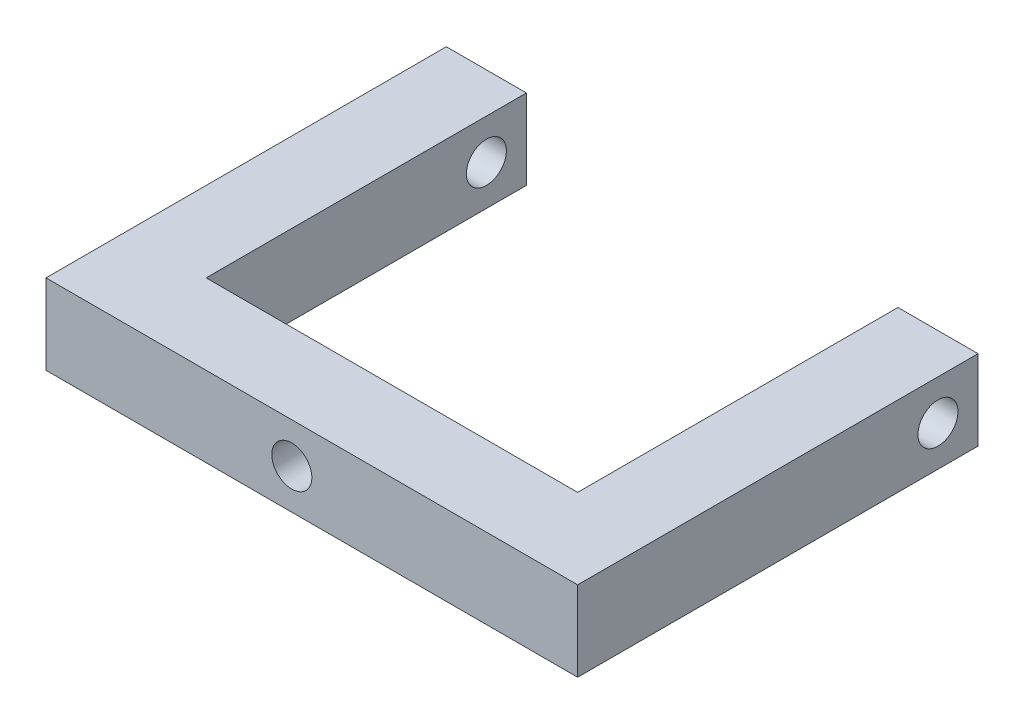
ISO-10303-21;
HEADER;
FILE_DESCRIPTION(('STEP AP214'),'2;1');
FILE_NAME('part.step','',(''),(''),'','','');
FILE_SCHEMA(('AUTOMOTIVE_DESIGN { 1 0 10303 214 1 1 1 1 }'));
ENDSEC;
DATA;
#1=APPLICATION_CONTEXT('core data for automotive mechanical design processes');
#2=APPLICATION_PROTOCOL_DEFINITION('international standard','automotive_design',2000,#1);
#3=PRODUCT_CONTEXT('',#1,'mechanical');
#4=PRODUCT('Part','Part','',(#3));
#5=PRODUCT_RELATED_PRODUCT_CATEGORY('part','',(#4));
#6=PRODUCT_DEFINITION_FORMATION('','',#4);
#7=PRODUCT_DEFINITION_CONTEXT('part definition',#1,'design');
#8=PRODUCT_DEFINITION('design','',#6,#7);
#9=PRODUCT_DEFINITION_SHAPE('','',#8);
#10=(LENGTH_UNIT() NAMED_UNIT(*) SI_UNIT(.MILLI.,.METRE.));
#11=(NAMED_UNIT(*) PLANE_ANGLE_UNIT() SI_UNIT($,.RADIAN.));
#12=(NAMED_UNIT(*) SI_UNIT($,.STERADIAN.) SOLID_ANGLE_UNIT());
#13=UNCERTAINTY_MEASURE_WITH_UNIT(LENGTH_MEASURE(1.E-05),#10,'distance_accuracy_value','');
#14=(GEOMETRIC_REPRESENTATION_CONTEXT(3) GLOBAL_UNCERTAINTY_ASSIGNED_CONTEXT((#13)) GLOBAL_UNIT_ASSIGNED_CONTEXT((#10,
#11,#12)) REPRESENTATION_CONTEXT('',''));
#15=CARTESIAN_POINT('',(0.,0.,0.));
#16=DIRECTION('',(0.,0.,1.));
#17=DIRECTION('',(1.,0.,0.));
#18=AXIS2_PLACEMENT_3D('',#15,#16,#17);
#19=CARTESIAN_POINT('',(0.,12.7,0.));
#20=DIRECTION('',(0.,0.,1.));
#21=DIRECTION('',(1.,0.,0.));
#22=AXIS2_PLACEMENT_3D('',#19,#20,#21);
#23=PLANE('',#22);
#24=CARTESIAN_POINT('',(-45.339,6.35,0.));
#25=DIRECTION('',(0.,0.,1.));
#26=DIRECTION('',(1.,0.,0.));
#27=AXIS2_PLACEMENT_3D('',#24,#25,#26);
#28=CIRCLE('',#27,3.175);
#29=CARTESIAN_POINT('',(-48.514,6.35,0.));
#30=VERTEX_POINT('',#29);
#31=EDGE_CURVE('E235',#30,#30,#28,.F.);
#32=ORIENTED_EDGE('',*,*,#31,.T.);
#33=EDGE_LOOP('',(#32));
#34=FACE_BOUND('',#33,.T.);
#35=DIRECTION('',(-1.,0.,0.));
#36=VECTOR('',#35,1.);
#37=CARTESIAN_POINT('',(0.,0.,0.));
#38=LINE('',#37,#36);
#39=CARTESIAN_POINT('',(0.,0.,0.));
#40=VERTEX_POINT('',#39);
#41=CARTESIAN_POINT('',(-84.328,0.,0.));
#42=VERTEX_POINT('',#41);
#43=EDGE_CURVE('E141',#40,#42,#38,.T.);
#44=ORIENTED_EDGE('',*,*,#43,.F.);
#45=DIRECTION('',(0.,-1.,0.));
#46=VECTOR('',#45,1.);
#47=CARTESIAN_POINT('',(0.,12.7,0.));
#48=LINE('',#47,#46);
#49=CARTESIAN_POINT('',(0.,12.7,0.));
#50=VERTEX_POINT('',#49);
#51=EDGE_CURVE('E11',#50,#40,#48,.T.);
#52=ORIENTED_EDGE('',*,*,#51,.F.);
#53=DIRECTION('',(-1.,0.,0.));
#54=VECTOR('',#53,1.);
#55=CARTESIAN_POINT('',(0.,12.7,0.));
#56=LINE('',#55,#54);
#57=CARTESIAN_POINT('',(-84.328,12.7,0.));
#58=VERTEX_POINT('',#57);
#59=EDGE_CURVE('E167',#50,#58,#56,.T.);
#60=ORIENTED_EDGE('',*,*,#59,.T.);
#61=DIRECTION('',(0.,-1.,0.));
#62=VECTOR('',#61,1.);
#63=CARTESIAN_POINT('',(-84.328,12.7,0.));
#64=LINE('',#63,#62);
#65=EDGE_CURVE('E41',#58,#42,#64,.T.);
#66=ORIENTED_EDGE('',*,*,#65,.T.);
#67=EDGE_LOOP('',(#44,#52,#60,#66));
#68=FACE_BOUND('',#67,.T.);
#69=ADVANCED_FACE('F38',(#34,#68),#23,.T.);
#70=CARTESIAN_POINT('',(0.,12.7,0.));
#71=DIRECTION('',(-1.,0.,0.));
#72=DIRECTION('',(0.,0.,1.));
#73=AXIS2_PLACEMENT_3D('',#70,#71,#72);
#74=PLANE('',#73);
#75=CARTESIAN_POINT('',(0.,6.35,-57.15));
#76=DIRECTION('',(1.,0.,0.));
#77=DIRECTION('',(0.,0.,-1.));
#78=AXIS2_PLACEMENT_3D('',#75,#76,#77);
#79=CIRCLE('',#78,3.17500000000015);
#80=CARTESIAN_POINT('',(0.,6.35,-60.3250000000002));
#81=VERTEX_POINT('',#80);
#82=EDGE_CURVE('E238',#81,#81,#79,.T.);
#83=ORIENTED_EDGE('',*,*,#82,.F.);
#84=EDGE_LOOP('',(#83));
#85=FACE_BOUND('',#84,.T.);
#86=DIRECTION('',(0.,0.,-1.));
#87=VECTOR('',#86,1.);
#88=CARTESIAN_POINT('',(0.,0.,0.));
#89=LINE('',#88,#87);
#90=CARTESIAN_POINT('',(0.,0.,-63.5));
#91=VERTEX_POINT('',#90);
#92=EDGE_CURVE('E165',#40,#91,#89,.T.);
#93=ORIENTED_EDGE('',*,*,#92,.T.);
#94=DIRECTION('',(0.,-1.,0.));
#95=VECTOR('',#94,1.);
#96=CARTESIAN_POINT('',(0.,12.7,-63.5));
#97=LINE('',#96,#95);
#98=CARTESIAN_POINT('',(0.,12.7,-63.5));
#99=VERTEX_POINT('',#98);
#100=EDGE_CURVE('E48',#99,#91,#97,.T.);
#101=ORIENTED_EDGE('',*,*,#100,.F.);
#102=DIRECTION('',(0.,0.,-1.));
#103=VECTOR('',#102,1.);
#104=CARTESIAN_POINT('',(0.,12.7,0.));
#105=LINE('',#104,#103);
#106=EDGE_CURVE('E126',#50,#99,#105,.T.);
#107=ORIENTED_EDGE('',*,*,#106,.F.);
#108=ORIENTED_EDGE('',*,*,#51,.T.);
#109=EDGE_LOOP('',(#93,#101,#107,#108));
#110=FACE_BOUND('',#109,.T.);
#111=ADVANCED_FACE('F188',(#85,#110),#74,.F.);
#112=CARTESIAN_POINT('',(-12.7,12.7,-63.5));
#113=DIRECTION('',(0.,0.,-1.));
#114=DIRECTION('',(-1.,0.,0.));
#115=AXIS2_PLACEMENT_3D('',#112,#113,#114);
#116=PLANE('',#115);
#117=DIRECTION('',(1.,0.,0.));
#118=VECTOR('',#117,1.);
#119=CARTESIAN_POINT('',(-12.7,0.,-63.5));
#120=LINE('',#119,#118);
#121=CARTESIAN_POINT('',(-12.7,0.,-63.5));
#122=VERTEX_POINT('',#121);
#123=EDGE_CURVE('E113',#122,#91,#120,.T.);
#124=ORIENTED_EDGE('',*,*,#123,.F.);
#125=DIRECTION('',(0.,-1.,0.));
#126=VECTOR('',#125,1.);
#127=CARTESIAN_POINT('',(-12.7,12.7,-63.5));
#128=LINE('',#127,#126);
#129=CARTESIAN_POINT('',(-12.7,12.7,-63.5));
#130=VERTEX_POINT('',#129);
#131=EDGE_CURVE('E108',#130,#122,#128,.T.);
#132=ORIENTED_EDGE('',*,*,#131,.F.);
#133=DIRECTION('',(1.,0.,0.));
#134=VECTOR('',#133,1.);
#135=CARTESIAN_POINT('',(-12.7,12.7,-63.5));
#136=LINE('',#135,#134);
#137=EDGE_CURVE('E111',#130,#99,#136,.T.);
#138=ORIENTED_EDGE('',*,*,#137,.T.);
#139=ORIENTED_EDGE('',*,*,#100,.T.);
#140=EDGE_LOOP('',(#124,#132,#138,#139));
#141=FACE_BOUND('',#140,.T.);
#142=ADVANCED_FACE('F110',(#141),#116,.T.);
#143=CARTESIAN_POINT('',(-12.7,12.7,-12.7));
#144=DIRECTION('',(-1.,0.,0.));
#145=DIRECTION('',(0.,0.,1.));
#146=AXIS2_PLACEMENT_3D('',#143,#144,#145);
#147=PLANE('',#146);
#148=CARTESIAN_POINT('',(-12.7,6.35,-57.15));
#149=DIRECTION('',(-1.,0.,0.));
#150=DIRECTION('',(0.,0.,1.));
#151=AXIS2_PLACEMENT_3D('',#148,#149,#150);
#152=CIRCLE('',#151,3.17500000000015);
#153=CARTESIAN_POINT('',(-12.7,6.35,-53.9749999999999));
#154=VERTEX_POINT('',#153);
#155=EDGE_CURVE('E146',#154,#154,#152,.T.);
#156=ORIENTED_EDGE('',*,*,#155,.F.);
#157=EDGE_LOOP('',(#156));
#158=FACE_BOUND('',#157,.T.);
#159=DIRECTION('',(0.,0.,-1.));
#160=VECTOR('',#159,1.);
#161=CARTESIAN_POINT('',(-12.7,0.,-12.7));
#162=LINE('',#161,#160);
#163=CARTESIAN_POINT('',(-12.7,0.,-12.7));
#164=VERTEX_POINT('',#163);
#165=EDGE_CURVE('E160',#164,#122,#162,.T.);
#166=ORIENTED_EDGE('',*,*,#165,.F.);
#167=DIRECTION('',(0.,-1.,0.));
#168=VECTOR('',#167,1.);
#169=CARTESIAN_POINT('',(-12.7,12.7,-12.7));
#170=LINE('',#169,#168);
#171=CARTESIAN_POINT('',(-12.7,12.7,-12.7));
#172=VERTEX_POINT('',#171);
#173=EDGE_CURVE('E119',#172,#164,#170,.T.);
#174=ORIENTED_EDGE('',*,*,#173,.F.);
#175=DIRECTION('',(0.,0.,-1.));
#176=VECTOR('',#175,1.);
#177=CARTESIAN_POINT('',(-12.7,12.7,-12.7));
#178=LINE('',#177,#176);
#179=EDGE_CURVE('E125',#172,#130,#178,.T.);
#180=ORIENTED_EDGE('',*,*,#179,.T.);
#181=ORIENTED_EDGE('',*,*,#131,.T.);
#182=EDGE_LOOP('',(#166,#174,#180,#181));
#183=FACE_BOUND('',#182,.T.);
#184=ADVANCED_FACE('F129',(#158,#183),#147,.T.);
#185=CARTESIAN_POINT('',(-12.7,12.7,-12.7));
#186=DIRECTION('',(0.,0.,1.));
#187=DIRECTION('',(1.,0.,0.));
#188=AXIS2_PLACEMENT_3D('',#185,#186,#187);
#189=PLANE('',#188);
#190=CARTESIAN_POINT('',(-45.339,6.35,-12.7));
#191=DIRECTION('',(0.,0.,-1.));
#192=DIRECTION('',(-1.,0.,0.));
#193=AXIS2_PLACEMENT_3D('',#190,#191,#192);
#194=CIRCLE('',#193,3.175);
#195=CARTESIAN_POINT('',(-48.514,6.35,-12.7));
#196=VERTEX_POINT('',#195);
#197=EDGE_CURVE('E239',#196,#196,#194,.T.);
#198=ORIENTED_EDGE('',*,*,#197,.F.);
#199=EDGE_LOOP('',(#198));
#200=FACE_BOUND('',#199,.T.);
#201=DIRECTION('',(-1.,0.,0.));
#202=VECTOR('',#201,1.);
#203=CARTESIAN_POINT('',(-12.7,0.,-12.7));
#204=LINE('',#203,#202);
#205=CARTESIAN_POINT('',(-71.628,0.,-12.7));
#206=VERTEX_POINT('',#205);
#207=EDGE_CURVE('E157',#164,#206,#204,.T.);
#208=ORIENTED_EDGE('',*,*,#207,.T.);
#209=DIRECTION('',(0.,-1.,0.));
#210=VECTOR('',#209,1.);
#211=CARTESIAN_POINT('',(-71.628,12.7,-12.7));
#212=LINE('',#211,#210);
#213=CARTESIAN_POINT('',(-71.628,12.7,-12.7));
#214=VERTEX_POINT('',#213);
#215=EDGE_CURVE('E173',#214,#206,#212,.T.);
#216=ORIENTED_EDGE('',*,*,#215,.F.);
#217=DIRECTION('',(-1.,0.,0.));
#218=VECTOR('',#217,1.);
#219=CARTESIAN_POINT('',(-12.7,12.7,-12.7));
#220=LINE('',#219,#218);
#221=EDGE_CURVE('E132',#172,#214,#220,.T.);
#222=ORIENTED_EDGE('',*,*,#221,.F.);
#223=ORIENTED_EDGE('',*,*,#173,.T.);
#224=EDGE_LOOP('',(#208,#216,#222,#223));
#225=FACE_BOUND('',#224,.T.);
#226=ADVANCED_FACE('F211',(#200,#225),#189,.F.);
#227=CARTESIAN_POINT('',(-71.628,12.7,-12.7));
#228=DIRECTION('',(-1.,0.,0.));
#229=DIRECTION('',(0.,0.,1.));
#230=AXIS2_PLACEMENT_3D('',#227,#228,#229);
#231=PLANE('',#230);
#232=CARTESIAN_POINT('',(-71.628,6.35,-57.15));
#233=DIRECTION('',(-1.,0.,0.));
#234=DIRECTION('',(0.,0.,1.));
#235=AXIS2_PLACEMENT_3D('',#232,#233,#234);
#236=CIRCLE('',#235,3.17500000000015);
#237=CARTESIAN_POINT('',(-71.628,6.35,-53.9749999999999));
#238=VERTEX_POINT('',#237);
#239=EDGE_CURVE('E251',#238,#238,#236,.T.);
#240=ORIENTED_EDGE('',*,*,#239,.T.);
#241=EDGE_LOOP('',(#240));
#242=FACE_BOUND('',#241,.T.);
#243=DIRECTION('',(0.,0.,-1.));
#244=VECTOR('',#243,1.);
#245=CARTESIAN_POINT('',(-71.628,0.,-12.7));
#246=LINE('',#245,#244);
#247=CARTESIAN_POINT('',(-71.628,0.,-63.5));
#248=VERTEX_POINT('',#247);
#249=EDGE_CURVE('E154',#206,#248,#246,.T.);
#250=ORIENTED_EDGE('',*,*,#249,.T.);
#251=DIRECTION('',(0.,-1.,0.));
#252=VECTOR('',#251,1.);
#253=CARTESIAN_POINT('',(-71.628,12.7,-63.5));
#254=LINE('',#253,#252);
#255=CARTESIAN_POINT('',(-71.628,12.7,-63.5));
#256=VERTEX_POINT('',#255);
#257=EDGE_CURVE('E177',#256,#248,#254,.T.);
#258=ORIENTED_EDGE('',*,*,#257,.F.);
#259=DIRECTION('',(0.,0.,-1.));
#260=VECTOR('',#259,1.);
#261=CARTESIAN_POINT('',(-71.628,12.7,-12.7));
#262=LINE('',#261,#260);
#263=EDGE_CURVE('E135',#214,#256,#262,.T.);
#264=ORIENTED_EDGE('',*,*,#263,.F.);
#265=ORIENTED_EDGE('',*,*,#215,.T.);
#266=EDGE_LOOP('',(#250,#258,#264,#265));
#267=FACE_BOUND('',#266,.T.);
#268=ADVANCED_FACE('F205',(#242,#267),#231,.F.);
#269=CARTESIAN_POINT('',(-71.628,12.7,-63.5));
#270=DIRECTION('',(0.,0.,1.));
#271=DIRECTION('',(1.,0.,0.));
#272=AXIS2_PLACEMENT_3D('',#269,#270,#271);
#273=PLANE('',#272);
#274=DIRECTION('',(-1.,0.,0.));
#275=VECTOR('',#274,1.);
#276=CARTESIAN_POINT('',(-71.628,0.,-63.5));
#277=LINE('',#276,#275);
#278=CARTESIAN_POINT('',(-84.328,0.,-63.5));
#279=VERTEX_POINT('',#278);
#280=EDGE_CURVE('E150',#248,#279,#277,.T.);
#281=ORIENTED_EDGE('',*,*,#280,.T.);
#282=DIRECTION('',(0.,-1.,0.));
#283=VECTOR('',#282,1.);
#284=CARTESIAN_POINT('',(-84.328,12.7,-63.5));
#285=LINE('',#284,#283);
#286=CARTESIAN_POINT('',(-84.328,12.7,-63.5));
#287=VERTEX_POINT('',#286);
#288=EDGE_CURVE('E180',#287,#279,#285,.T.);
#289=ORIENTED_EDGE('',*,*,#288,.F.);
#290=DIRECTION('',(-1.,0.,0.));
#291=VECTOR('',#290,1.);
#292=CARTESIAN_POINT('',(-71.628,12.7,-63.5));
#293=LINE('',#292,#291);
#294=EDGE_CURVE('E193',#256,#287,#293,.T.);
#295=ORIENTED_EDGE('',*,*,#294,.F.);
#296=ORIENTED_EDGE('',*,*,#257,.T.);
#297=EDGE_LOOP('',(#281,#289,#295,#296));
#298=FACE_BOUND('',#297,.T.);
#299=ADVANCED_FACE('F208',(#298),#273,.F.);
#300=CARTESIAN_POINT('',(-84.328,12.7,0.));
#301=DIRECTION('',(-1.,0.,0.));
#302=DIRECTION('',(0.,0.,1.));
#303=AXIS2_PLACEMENT_3D('',#300,#301,#302);
#304=PLANE('',#303);
#305=CARTESIAN_POINT('',(-84.328,6.35,-57.15));
#306=DIRECTION('',(-1.,0.,0.));
#307=DIRECTION('',(0.,0.,1.));
#308=AXIS2_PLACEMENT_3D('',#305,#306,#307);
#309=CIRCLE('',#308,3.17500000000015);
#310=CARTESIAN_POINT('',(-84.328,6.35,-53.9749999999999));
#311=VERTEX_POINT('',#310);
#312=EDGE_CURVE('E244',#311,#311,#309,.F.);
#313=ORIENTED_EDGE('',*,*,#312,.T.);
#314=EDGE_LOOP('',(#313));
#315=FACE_BOUND('',#314,.T.);
#316=DIRECTION('',(0.,0.,-1.));
#317=VECTOR('',#316,1.);
#318=CARTESIAN_POINT('',(-84.328,0.,0.));
#319=LINE('',#318,#317);
#320=EDGE_CURVE('E145',#42,#279,#319,.T.);
#321=ORIENTED_EDGE('',*,*,#320,.F.);
#322=ORIENTED_EDGE('',*,*,#65,.F.);
#323=DIRECTION('',(0.,0.,-1.));
#324=VECTOR('',#323,1.);
#325=CARTESIAN_POINT('',(-84.328,12.7,0.));
#326=LINE('',#325,#324);
#327=EDGE_CURVE('E189',#58,#287,#326,.T.);
#328=ORIENTED_EDGE('',*,*,#327,.T.);
#329=ORIENTED_EDGE('',*,*,#288,.T.);
#330=EDGE_LOOP('',(#321,#322,#328,#329));
#331=FACE_BOUND('',#330,.T.);
#332=ADVANCED_FACE('F184',(#315,#331),#304,.T.);
#333=CARTESIAN_POINT('',(0.,12.7,0.));
#334=DIRECTION('',(0.,-1.,0.));
#335=DIRECTION('',(0.,0.,-1.));
#336=AXIS2_PLACEMENT_3D('',#333,#334,#335);
#337=PLANE('',#336);
#338=ORIENTED_EDGE('',*,*,#59,.F.);
#339=ORIENTED_EDGE('',*,*,#106,.T.);
#340=ORIENTED_EDGE('',*,*,#137,.F.);
#341=ORIENTED_EDGE('',*,*,#179,.F.);
#342=ORIENTED_EDGE('',*,*,#221,.T.);
#343=ORIENTED_EDGE('',*,*,#263,.T.);
#344=ORIENTED_EDGE('',*,*,#294,.T.);
#345=ORIENTED_EDGE('',*,*,#327,.F.);
#346=EDGE_LOOP('',(#338,#339,#340,#341,#342,#343,#344,#345));
#347=FACE_BOUND('',#346,.T.);
#348=ADVANCED_FACE('F124',(#347),#337,.F.);
#349=CARTESIAN_POINT('',(0.,0.,0.));
#350=DIRECTION('',(0.,-1.,0.));
#351=DIRECTION('',(0.,0.,-1.));
#352=AXIS2_PLACEMENT_3D('',#349,#350,#351);
#353=PLANE('',#352);
#354=ORIENTED_EDGE('',*,*,#43,.T.);
#355=ORIENTED_EDGE('',*,*,#320,.T.);
#356=ORIENTED_EDGE('',*,*,#280,.F.);
#357=ORIENTED_EDGE('',*,*,#249,.F.);
#358=ORIENTED_EDGE('',*,*,#207,.F.);
#359=ORIENTED_EDGE('',*,*,#165,.T.);
#360=ORIENTED_EDGE('',*,*,#123,.T.);
#361=ORIENTED_EDGE('',*,*,#92,.F.);
#362=EDGE_LOOP('',(#354,#355,#356,#357,#358,#359,#360,#361));
#363=FACE_BOUND('',#362,.T.);
#364=ADVANCED_FACE('F187',(#363),#353,.T.);
#365=CARTESIAN_POINT('',(-93.3082561210695,6.35,-57.15));
#366=DIRECTION('',(1.,0.,0.));
#367=DIRECTION('',(0.,0.,-1.));
#368=AXIS2_PLACEMENT_3D('',#365,#366,#367);
#369=CYLINDRICAL_SURFACE('',#368,3.17500000000015);
#370=ORIENTED_EDGE('',*,*,#312,.F.);
#371=EDGE_LOOP('',(#370));
#372=FACE_BOUND('',#371,.T.);
#373=ORIENTED_EDGE('',*,*,#239,.F.);
#374=EDGE_LOOP('',(#373));
#375=FACE_BOUND('',#374,.T.);
#376=ADVANCED_FACE('F263',(#372,#375),#369,.F.);
#377=ORIENTED_EDGE('',*,*,#155,.T.);
#378=EDGE_LOOP('',(#377));
#379=FACE_BOUND('',#378,.T.);
#380=ORIENTED_EDGE('',*,*,#82,.T.);
#381=EDGE_LOOP('',(#380));
#382=FACE_BOUND('',#381,.T.);
#383=ADVANCED_FACE('F259',(#379,#382),#369,.F.);
#384=CARTESIAN_POINT('',(-45.339,6.35,8.98025612106915));
#385=DIRECTION('',(0.,0.,-1.));
#386=DIRECTION('',(-1.,0.,0.));
#387=AXIS2_PLACEMENT_3D('',#384,#385,#386);
#388=CYLINDRICAL_SURFACE('',#387,3.175);
#389=CARTESIAN_POINT('',(-48.514,6.35,-12.7));
#390=CARTESIAN_POINT('',(-48.514,6.35,-12.5677083333333));
#391=CARTESIAN_POINT('',(-48.514,6.35,-12.4354166666667));
#392=CARTESIAN_POINT('',(-48.514,6.35,-12.1708333333333));
#393=CARTESIAN_POINT('',(-48.514,6.35,-12.0385416666667));
#394=CARTESIAN_POINT('',(-48.514,6.35,-11.7739583333333));
#395=CARTESIAN_POINT('',(-48.514,6.35,-11.6416666666667));
#396=CARTESIAN_POINT('',(-48.514,6.35,-11.3770833333333));
#397=CARTESIAN_POINT('',(-48.514,6.35,-11.2447916666667));
#398=CARTESIAN_POINT('',(-48.514,6.35,-10.9802083333333));
#399=CARTESIAN_POINT('',(-48.514,6.35,-10.8479166666667));
#400=CARTESIAN_POINT('',(-48.514,6.35,-10.5833333333333));
#401=CARTESIAN_POINT('',(-48.514,6.35,-10.4510416666667));
#402=CARTESIAN_POINT('',(-48.514,6.35,-10.1864583333333));
#403=CARTESIAN_POINT('',(-48.514,6.35,-10.0541666666667));
#404=CARTESIAN_POINT('',(-48.514,6.35,-9.78958333333334));
#405=CARTESIAN_POINT('',(-48.514,6.35,-9.65729166666667));
#406=CARTESIAN_POINT('',(-48.514,6.35,-9.39270833333334));
#407=CARTESIAN_POINT('',(-48.514,6.35,-9.26041666666667));
#408=CARTESIAN_POINT('',(-48.514,6.35,-8.99583333333334));
#409=CARTESIAN_POINT('',(-48.514,6.35,-8.86354166666667));
#410=CARTESIAN_POINT('',(-48.514,6.35,-8.59895833333334));
#411=CARTESIAN_POINT('',(-48.514,6.35,-8.46666666666667));
#412=CARTESIAN_POINT('',(-48.514,6.35,-8.20208333333334));
#413=CARTESIAN_POINT('',(-48.514,6.35,-8.06979166666667));
#414=CARTESIAN_POINT('',(-48.514,6.35,-7.80520833333334));
#415=CARTESIAN_POINT('',(-48.514,6.35,-7.67291666666667));
#416=CARTESIAN_POINT('',(-48.514,6.35,-7.40833333333333));
#417=CARTESIAN_POINT('',(-48.514,6.35,-7.27604166666667));
#418=CARTESIAN_POINT('',(-48.514,6.35,-7.01145833333333));
#419=CARTESIAN_POINT('',(-48.514,6.35,-6.87916666666667));
#420=CARTESIAN_POINT('',(-48.514,6.35,-6.61458333333333));
#421=CARTESIAN_POINT('',(-48.514,6.35,-6.48229166666667));
#422=CARTESIAN_POINT('',(-48.514,6.35,-6.21770833333333));
#423=CARTESIAN_POINT('',(-48.514,6.35,-6.08541666666667));
#424=CARTESIAN_POINT('',(-48.514,6.35,-5.82083333333333));
#425=CARTESIAN_POINT('',(-48.514,6.35,-5.68854166666667));
#426=CARTESIAN_POINT('',(-48.514,6.35,-5.42395833333333));
#427=CARTESIAN_POINT('',(-48.514,6.35,-5.29166666666667));
#428=CARTESIAN_POINT('',(-48.514,6.35,-5.02708333333333));
#429=CARTESIAN_POINT('',(-48.514,6.35,-4.89479166666667));
#430=CARTESIAN_POINT('',(-48.514,6.35,-4.63020833333333));
#431=CARTESIAN_POINT('',(-48.514,6.35,-4.49791666666667));
#432=CARTESIAN_POINT('',(-48.514,6.35,-4.23333333333333));
#433=CARTESIAN_POINT('',(-48.514,6.35,-4.10104166666667));
#434=CARTESIAN_POINT('',(-48.514,6.35,-3.83645833333333));
#435=CARTESIAN_POINT('',(-48.514,6.35,-3.70416666666667));
#436=CARTESIAN_POINT('',(-48.514,6.35,-3.43958333333333));
#437=CARTESIAN_POINT('',(-48.514,6.35,-3.30729166666667));
#438=CARTESIAN_POINT('',(-48.514,6.35,-3.04270833333333));
#439=CARTESIAN_POINT('',(-48.514,6.35,-2.91041666666667));
#440=CARTESIAN_POINT('',(-48.514,6.35,-2.64583333333333));
#441=CARTESIAN_POINT('',(-48.514,6.35,-2.51354166666666));
#442=CARTESIAN_POINT('',(-48.514,6.35,-2.24895833333333));
#443=CARTESIAN_POINT('',(-48.514,6.35,-2.11666666666666));
#444=CARTESIAN_POINT('',(-48.514,6.35,-1.85208333333333));
#445=CARTESIAN_POINT('',(-48.514,6.35,-1.71979166666666));
#446=CARTESIAN_POINT('',(-48.514,6.35,-1.45520833333333));
#447=CARTESIAN_POINT('',(-48.514,6.35,-1.32291666666666));
#448=CARTESIAN_POINT('',(-48.514,6.35,-1.05833333333333));
#449=CARTESIAN_POINT('',(-48.514,6.35,-0.926041666666662));
#450=CARTESIAN_POINT('',(-48.514,6.35,-0.661458333333329));
#451=CARTESIAN_POINT('',(-48.514,6.35,-0.529166666666662));
#452=CARTESIAN_POINT('',(-48.514,6.35,-0.264583333333328));
#453=CARTESIAN_POINT('',(-48.514,6.35,-0.132291666666661));
#454=CARTESIAN_POINT('',(-48.514,6.35,0.));
#455=B_SPLINE_CURVE_WITH_KNOTS('',3,(#389,#390,#391,#392,#393,#394,#395,#396,#397,#398,#399,
#400,#401,#402,#403,#404,#405,#406,#407,#408,#409,#410,#411,#412,#413,#414,#415,#416,#417,#418,
#419,#420,#421,#422,#423,#424,#425,#426,#427,#428,#429,#430,#431,#432,#433,#434,#435,#436,#437,
#438,#439,#440,#441,#442,#443,#444,#445,#446,#447,#448,#449,#450,#451,#452,#453,#454),
.UNSPECIFIED.,.F.,.F.,(4,2,2,2,2,2,2,2,2,2,2,2,2,2,2,2,2,2,2,2,2,2,2,2,2,2,2,2,2,2,2,2,4),(0.,
0.396875000000001,0.793749999999999,1.190625,1.5875,1.984375,2.38125,2.778125,3.175,3.571875,
3.96875,4.365625,4.7625,5.159375,5.55625000000001,5.95312500000001,6.35,6.746875,
7.14375000000001,7.54062500000001,7.93750000000001,8.33437500000001,8.73125000000001,
9.12812500000001,9.52500000000001,9.92187500000001,10.31875,10.715625,11.1125,11.509375,
11.90625,12.303125,12.7),.UNSPECIFIED.);
#456=EDGE_CURVE('BSEAM262',#196,#30,#455,.T.);
#457=ORIENTED_EDGE('',*,*,#197,.T.);
#458=ORIENTED_EDGE('',*,*,#31,.F.);
#459=ORIENTED_EDGE('',*,*,#456,.T.);
#460=ORIENTED_EDGE('',*,*,#456,.F.);
#461=EDGE_LOOP('',(#457,#459,#458,#460));
#462=FACE_BOUND('',#461,.T.);
#463=ADVANCED_FACE('F262',(#462),#388,.F.);
#464=CLOSED_SHELL('',(#69,#111,#142,#184,#226,#268,#299,#332,#348,#364,#376,#383,#463));
#465=MANIFOLD_SOLID_BREP('B2',#464);
#466=ADVANCED_BREP_SHAPE_REPRESENTATION('',(#18,#465),#14);
#467=SHAPE_DEFINITION_REPRESENTATION(#9,#466);
ENDSEC;
END-ISO-10303-21;
